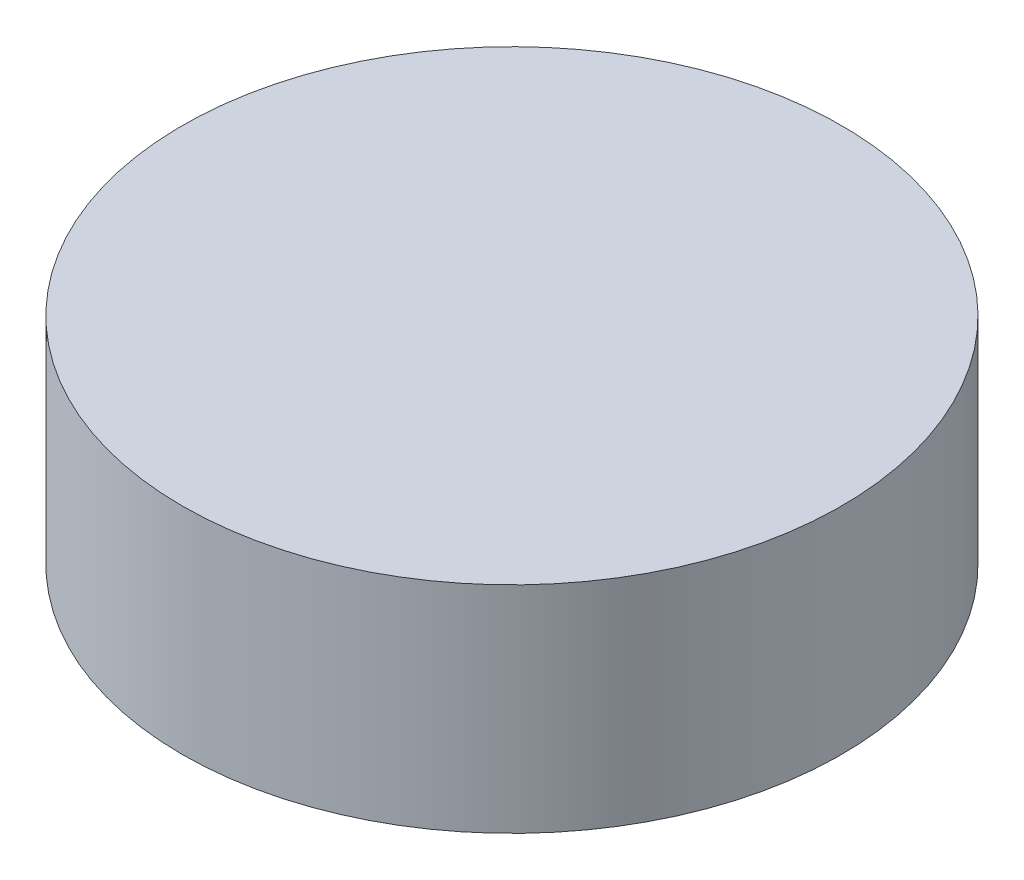
ISO-10303-21;
HEADER;
FILE_DESCRIPTION(('STEP AP214'),'2;1');
FILE_NAME('part.step','',(''),(''),'','','');
FILE_SCHEMA(('AUTOMOTIVE_DESIGN { 1 0 10303 214 1 1 1 1 }'));
ENDSEC;
DATA;
#1=APPLICATION_CONTEXT('core data for automotive mechanical design processes');
#2=APPLICATION_PROTOCOL_DEFINITION('international standard','automotive_design',2000,#1);
#3=PRODUCT_CONTEXT('',#1,'mechanical');
#4=PRODUCT('Part','Part','',(#3));
#5=PRODUCT_RELATED_PRODUCT_CATEGORY('part','',(#4));
#6=PRODUCT_DEFINITION_FORMATION('','',#4);
#7=PRODUCT_DEFINITION_CONTEXT('part definition',#1,'design');
#8=PRODUCT_DEFINITION('design','',#6,#7);
#9=PRODUCT_DEFINITION_SHAPE('','',#8);
#10=(LENGTH_UNIT() NAMED_UNIT(*) SI_UNIT(.MILLI.,.METRE.));
#11=(NAMED_UNIT(*) PLANE_ANGLE_UNIT() SI_UNIT($,.RADIAN.));
#12=(NAMED_UNIT(*) SI_UNIT($,.STERADIAN.) SOLID_ANGLE_UNIT());
#13=UNCERTAINTY_MEASURE_WITH_UNIT(LENGTH_MEASURE(1.E-05),#10,'distance_accuracy_value','');
#14=(GEOMETRIC_REPRESENTATION_CONTEXT(3) GLOBAL_UNCERTAINTY_ASSIGNED_CONTEXT((#13)) GLOBAL_UNIT_ASSIGNED_CONTEXT((#10,
#11,#12)) REPRESENTATION_CONTEXT('',''));
#15=CARTESIAN_POINT('',(0.,0.,0.));
#16=DIRECTION('',(0.,0.,1.));
#17=DIRECTION('',(1.,0.,0.));
#18=AXIS2_PLACEMENT_3D('',#15,#16,#17);
#19=CARTESIAN_POINT('',(0.,1.6,0.));
#20=DIRECTION('',(0.,-1.,0.));
#21=DIRECTION('',(0.,0.,-1.));
#22=AXIS2_PLACEMENT_3D('',#19,#20,#21);
#23=CYLINDRICAL_SURFACE('',#22,2.45);
#24=CARTESIAN_POINT('',(0.,1.6,0.));
#25=DIRECTION('',(0.,1.,0.));
#26=DIRECTION('',(0.,0.,1.));
#27=AXIS2_PLACEMENT_3D('',#24,#25,#26);
#28=CIRCLE('',#27,2.45);
#29=CARTESIAN_POINT('',(0.,1.6,2.45));
#30=VERTEX_POINT('',#29);
#31=EDGE_CURVE('E10',#30,#30,#28,.T.);
#32=ORIENTED_EDGE('',*,*,#31,.F.);
#33=EDGE_LOOP('',(#32));
#34=FACE_BOUND('',#33,.T.);
#35=CARTESIAN_POINT('',(0.,0.,0.));
#36=DIRECTION('',(0.,1.,0.));
#37=DIRECTION('',(0.,0.,1.));
#38=AXIS2_PLACEMENT_3D('',#35,#36,#37);
#39=CIRCLE('',#38,2.45);
#40=CARTESIAN_POINT('',(0.,0.,2.45));
#41=VERTEX_POINT('',#40);
#42=EDGE_CURVE('E36',#41,#41,#39,.T.);
#43=ORIENTED_EDGE('',*,*,#42,.T.);
#44=EDGE_LOOP('',(#43));
#45=FACE_BOUND('',#44,.T.);
#46=ADVANCED_FACE('F33',(#34,#45),#23,.T.);
#47=CARTESIAN_POINT('',(0.,1.6,0.));
#48=DIRECTION('',(0.,1.,0.));
#49=DIRECTION('',(0.,0.,1.));
#50=AXIS2_PLACEMENT_3D('',#47,#48,#49);
#51=PLANE('',#50);
#52=ORIENTED_EDGE('',*,*,#31,.T.);
#53=EDGE_LOOP('',(#52));
#54=FACE_BOUND('',#53,.T.);
#55=ADVANCED_FACE('F48',(#54),#51,.T.);
#56=CARTESIAN_POINT('',(0.,0.,0.));
#57=DIRECTION('',(0.,1.,0.));
#58=DIRECTION('',(0.,0.,1.));
#59=AXIS2_PLACEMENT_3D('',#56,#57,#58);
#60=PLANE('',#59);
#61=ORIENTED_EDGE('',*,*,#42,.F.);
#62=EDGE_LOOP('',(#61));
#63=FACE_BOUND('',#62,.T.);
#64=ADVANCED_FACE('F46',(#63),#60,.F.);
#65=CLOSED_SHELL('',(#46,#55,#64));
#66=MANIFOLD_SOLID_BREP('B2',#65);
#67=ADVANCED_BREP_SHAPE_REPRESENTATION('',(#18,#66),#14);
#68=SHAPE_DEFINITION_REPRESENTATION(#9,#67);
ENDSEC;
END-ISO-10303-21;
